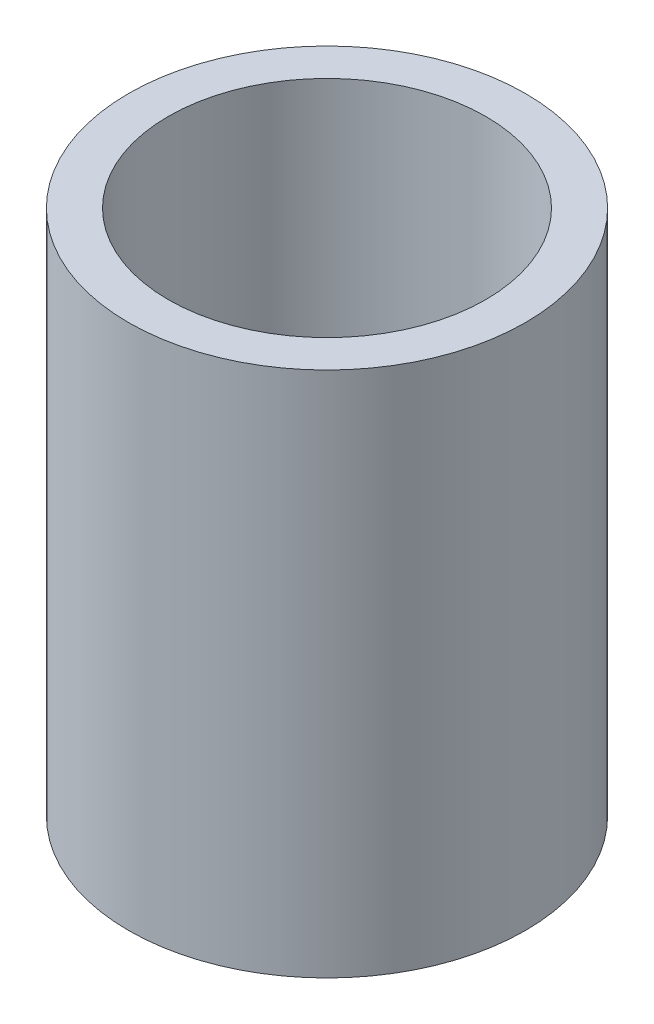
ISO-10303-21;
HEADER;
FILE_DESCRIPTION(('STEP AP214'),'2;1');
FILE_NAME('part.step','',(''),(''),'','','');
FILE_SCHEMA(('AUTOMOTIVE_DESIGN { 1 0 10303 214 1 1 1 1 }'));
ENDSEC;
DATA;
#1=APPLICATION_CONTEXT('core data for automotive mechanical design processes');
#2=APPLICATION_PROTOCOL_DEFINITION('international standard','automotive_design',2000,#1);
#3=PRODUCT_CONTEXT('',#1,'mechanical');
#4=PRODUCT('Part','Part','',(#3));
#5=PRODUCT_RELATED_PRODUCT_CATEGORY('part','',(#4));
#6=PRODUCT_DEFINITION_FORMATION('','',#4);
#7=PRODUCT_DEFINITION_CONTEXT('part definition',#1,'design');
#8=PRODUCT_DEFINITION('design','',#6,#7);
#9=PRODUCT_DEFINITION_SHAPE('','',#8);
#10=(LENGTH_UNIT() NAMED_UNIT(*) SI_UNIT(.MILLI.,.METRE.));
#11=(NAMED_UNIT(*) PLANE_ANGLE_UNIT() SI_UNIT($,.RADIAN.));
#12=(NAMED_UNIT(*) SI_UNIT($,.STERADIAN.) SOLID_ANGLE_UNIT());
#13=UNCERTAINTY_MEASURE_WITH_UNIT(LENGTH_MEASURE(1.E-05),#10,'distance_accuracy_value','');
#14=(GEOMETRIC_REPRESENTATION_CONTEXT(3) GLOBAL_UNCERTAINTY_ASSIGNED_CONTEXT((#13)) GLOBAL_UNIT_ASSIGNED_CONTEXT((#10,
#11,#12)) REPRESENTATION_CONTEXT('',''));
#15=CARTESIAN_POINT('',(0.,0.,0.));
#16=DIRECTION('',(0.,0.,1.));
#17=DIRECTION('',(1.,0.,0.));
#18=AXIS2_PLACEMENT_3D('',#15,#16,#17);
#19=CARTESIAN_POINT('',(0.,0.,0.));
#20=DIRECTION('',(0.,-1.,0.));
#21=DIRECTION('',(0.,0.,-1.));
#22=AXIS2_PLACEMENT_3D('',#19,#20,#21);
#23=PLANE('',#22);
#24=CARTESIAN_POINT('',(0.,0.,0.));
#25=DIRECTION('',(0.,-1.,0.));
#26=DIRECTION('',(0.,0.,-1.));
#27=AXIS2_PLACEMENT_3D('',#24,#25,#26);
#28=CIRCLE('',#27,7.5);
#29=CARTESIAN_POINT('',(0.,0.,-7.5));
#30=VERTEX_POINT('',#29);
#31=EDGE_CURVE('E10',#30,#30,#28,.T.);
#32=ORIENTED_EDGE('',*,*,#31,.T.);
#33=EDGE_LOOP('',(#32));
#34=FACE_BOUND('',#33,.T.);
#35=CARTESIAN_POINT('',(0.,0.,0.));
#36=DIRECTION('',(0.,-1.,0.));
#37=DIRECTION('',(0.,0.,-1.));
#38=AXIS2_PLACEMENT_3D('',#35,#36,#37);
#39=CIRCLE('',#38,6.);
#40=CARTESIAN_POINT('',(0.,0.,-6.));
#41=VERTEX_POINT('',#40);
#42=EDGE_CURVE('E60',#41,#41,#39,.T.);
#43=ORIENTED_EDGE('',*,*,#42,.F.);
#44=EDGE_LOOP('',(#43));
#45=FACE_BOUND('',#44,.T.);
#46=ADVANCED_FACE('F43',(#34,#45),#23,.T.);
#47=CARTESIAN_POINT('',(0.,0.,0.));
#48=DIRECTION('',(0.,-1.,0.));
#49=DIRECTION('',(0.,0.,-1.));
#50=AXIS2_PLACEMENT_3D('',#47,#48,#49);
#51=CYLINDRICAL_SURFACE('',#50,7.5);
#52=CARTESIAN_POINT('',(0.,19.9,0.));
#53=DIRECTION('',(0.,-1.,0.));
#54=DIRECTION('',(0.,0.,-1.));
#55=AXIS2_PLACEMENT_3D('',#52,#53,#54);
#56=CIRCLE('',#55,7.5);
#57=CARTESIAN_POINT('',(0.,19.9,-7.5));
#58=VERTEX_POINT('',#57);
#59=EDGE_CURVE('E50',#58,#58,#56,.T.);
#60=ORIENTED_EDGE('',*,*,#59,.T.);
#61=EDGE_LOOP('',(#60));
#62=FACE_BOUND('',#61,.T.);
#63=ORIENTED_EDGE('',*,*,#31,.F.);
#64=EDGE_LOOP('',(#63));
#65=FACE_BOUND('',#64,.T.);
#66=ADVANCED_FACE('F70',(#62,#65),#51,.T.);
#67=CARTESIAN_POINT('',(0.,19.9,0.));
#68=DIRECTION('',(0.,-1.,0.));
#69=DIRECTION('',(0.,0.,-1.));
#70=AXIS2_PLACEMENT_3D('',#67,#68,#69);
#71=PLANE('',#70);
#72=ORIENTED_EDGE('',*,*,#59,.F.);
#73=EDGE_LOOP('',(#72));
#74=FACE_BOUND('',#73,.T.);
#75=CARTESIAN_POINT('',(0.,19.9,0.));
#76=DIRECTION('',(0.,-1.,0.));
#77=DIRECTION('',(0.,0.,-1.));
#78=AXIS2_PLACEMENT_3D('',#75,#76,#77);
#79=CIRCLE('',#78,6.);
#80=CARTESIAN_POINT('',(0.,19.9,-6.));
#81=VERTEX_POINT('',#80);
#82=EDGE_CURVE('E55',#81,#81,#79,.T.);
#83=ORIENTED_EDGE('',*,*,#82,.T.);
#84=EDGE_LOOP('',(#83));
#85=FACE_BOUND('',#84,.T.);
#86=ADVANCED_FACE('F74',(#74,#85),#71,.F.);
#87=CARTESIAN_POINT('',(0.,0.,0.));
#88=DIRECTION('',(0.,-1.,0.));
#89=DIRECTION('',(0.,0.,-1.));
#90=AXIS2_PLACEMENT_3D('',#87,#88,#89);
#91=CYLINDRICAL_SURFACE('',#90,6.);
#92=ORIENTED_EDGE('',*,*,#82,.F.);
#93=EDGE_LOOP('',(#92));
#94=FACE_BOUND('',#93,.T.);
#95=ORIENTED_EDGE('',*,*,#42,.T.);
#96=EDGE_LOOP('',(#95));
#97=FACE_BOUND('',#96,.T.);
#98=ADVANCED_FACE('F67',(#94,#97),#91,.F.);
#99=CLOSED_SHELL('',(#46,#66,#86,#98));
#100=MANIFOLD_SOLID_BREP('B2',#99);
#101=ADVANCED_BREP_SHAPE_REPRESENTATION('',(#18,#100),#14);
#102=SHAPE_DEFINITION_REPRESENTATION(#9,#101);
ENDSEC;
END-ISO-10303-21;
